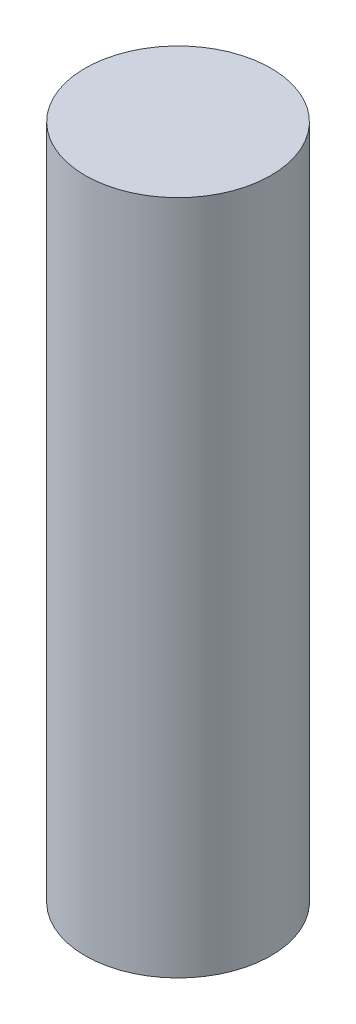
ISO-10303-21;
HEADER;
FILE_DESCRIPTION(('STEP AP214'),'2;1');
FILE_NAME('part.step','',(''),(''),'','','');
FILE_SCHEMA(('AUTOMOTIVE_DESIGN { 1 0 10303 214 1 1 1 1 }'));
ENDSEC;
DATA;
#1=APPLICATION_CONTEXT('core data for automotive mechanical design processes');
#2=APPLICATION_PROTOCOL_DEFINITION('international standard','automotive_design',2000,#1);
#3=PRODUCT_CONTEXT('',#1,'mechanical');
#4=PRODUCT('Part','Part','',(#3));
#5=PRODUCT_RELATED_PRODUCT_CATEGORY('part','',(#4));
#6=PRODUCT_DEFINITION_FORMATION('','',#4);
#7=PRODUCT_DEFINITION_CONTEXT('part definition',#1,'design');
#8=PRODUCT_DEFINITION('design','',#6,#7);
#9=PRODUCT_DEFINITION_SHAPE('','',#8);
#10=(LENGTH_UNIT() NAMED_UNIT(*) SI_UNIT(.MILLI.,.METRE.));
#11=(NAMED_UNIT(*) PLANE_ANGLE_UNIT() SI_UNIT($,.RADIAN.));
#12=(NAMED_UNIT(*) SI_UNIT($,.STERADIAN.) SOLID_ANGLE_UNIT());
#13=UNCERTAINTY_MEASURE_WITH_UNIT(LENGTH_MEASURE(1.E-05),#10,'distance_accuracy_value','');
#14=(GEOMETRIC_REPRESENTATION_CONTEXT(3) GLOBAL_UNCERTAINTY_ASSIGNED_CONTEXT((#13)) GLOBAL_UNIT_ASSIGNED_CONTEXT((#10,
#11,#12)) REPRESENTATION_CONTEXT('',''));
#15=CARTESIAN_POINT('',(0.,0.,0.));
#16=DIRECTION('',(0.,0.,1.));
#17=DIRECTION('',(1.,0.,0.));
#18=AXIS2_PLACEMENT_3D('',#15,#16,#17);
#19=CARTESIAN_POINT('',(0.,100.,0.));
#20=DIRECTION('',(0.,-1.,0.));
#21=DIRECTION('',(0.,0.,-1.));
#22=AXIS2_PLACEMENT_3D('',#19,#20,#21);
#23=CYLINDRICAL_SURFACE('',#22,27.5);
#24=CARTESIAN_POINT('',(0.,100.,0.));
#25=DIRECTION('',(0.,1.,0.));
#26=DIRECTION('',(0.,0.,1.));
#27=AXIS2_PLACEMENT_3D('',#24,#25,#26);
#28=CIRCLE('',#27,27.5);
#29=CARTESIAN_POINT('',(0.,100.,27.5));
#30=VERTEX_POINT('',#29);
#31=EDGE_CURVE('E10',#30,#30,#28,.T.);
#32=ORIENTED_EDGE('',*,*,#31,.F.);
#33=EDGE_LOOP('',(#32));
#34=FACE_BOUND('',#33,.T.);
#35=CARTESIAN_POINT('',(0.,-100.,0.));
#36=DIRECTION('',(0.,1.,0.));
#37=DIRECTION('',(0.,0.,1.));
#38=AXIS2_PLACEMENT_3D('',#35,#36,#37);
#39=CIRCLE('',#38,27.5);
#40=CARTESIAN_POINT('',(0.,-100.,27.5));
#41=VERTEX_POINT('',#40);
#42=EDGE_CURVE('E33',#41,#41,#39,.T.);
#43=ORIENTED_EDGE('',*,*,#42,.T.);
#44=EDGE_LOOP('',(#43));
#45=FACE_BOUND('',#44,.T.);
#46=ADVANCED_FACE('F30',(#34,#45),#23,.T.);
#47=CARTESIAN_POINT('',(0.,100.,0.));
#48=DIRECTION('',(0.,1.,0.));
#49=DIRECTION('',(0.,0.,1.));
#50=AXIS2_PLACEMENT_3D('',#47,#48,#49);
#51=PLANE('',#50);
#52=ORIENTED_EDGE('',*,*,#31,.T.);
#53=EDGE_LOOP('',(#52));
#54=FACE_BOUND('',#53,.T.);
#55=ADVANCED_FACE('F45',(#54),#51,.T.);
#56=CARTESIAN_POINT('',(0.,-100.,0.));
#57=DIRECTION('',(0.,1.,0.));
#58=DIRECTION('',(0.,0.,1.));
#59=AXIS2_PLACEMENT_3D('',#56,#57,#58);
#60=PLANE('',#59);
#61=ORIENTED_EDGE('',*,*,#42,.F.);
#62=EDGE_LOOP('',(#61));
#63=FACE_BOUND('',#62,.T.);
#64=ADVANCED_FACE('F43',(#63),#60,.F.);
#65=CLOSED_SHELL('',(#46,#55,#64));
#66=MANIFOLD_SOLID_BREP('B2',#65);
#67=ADVANCED_BREP_SHAPE_REPRESENTATION('',(#18,#66),#14);
#68=SHAPE_DEFINITION_REPRESENTATION(#9,#67);
ENDSEC;
END-ISO-10303-21;
